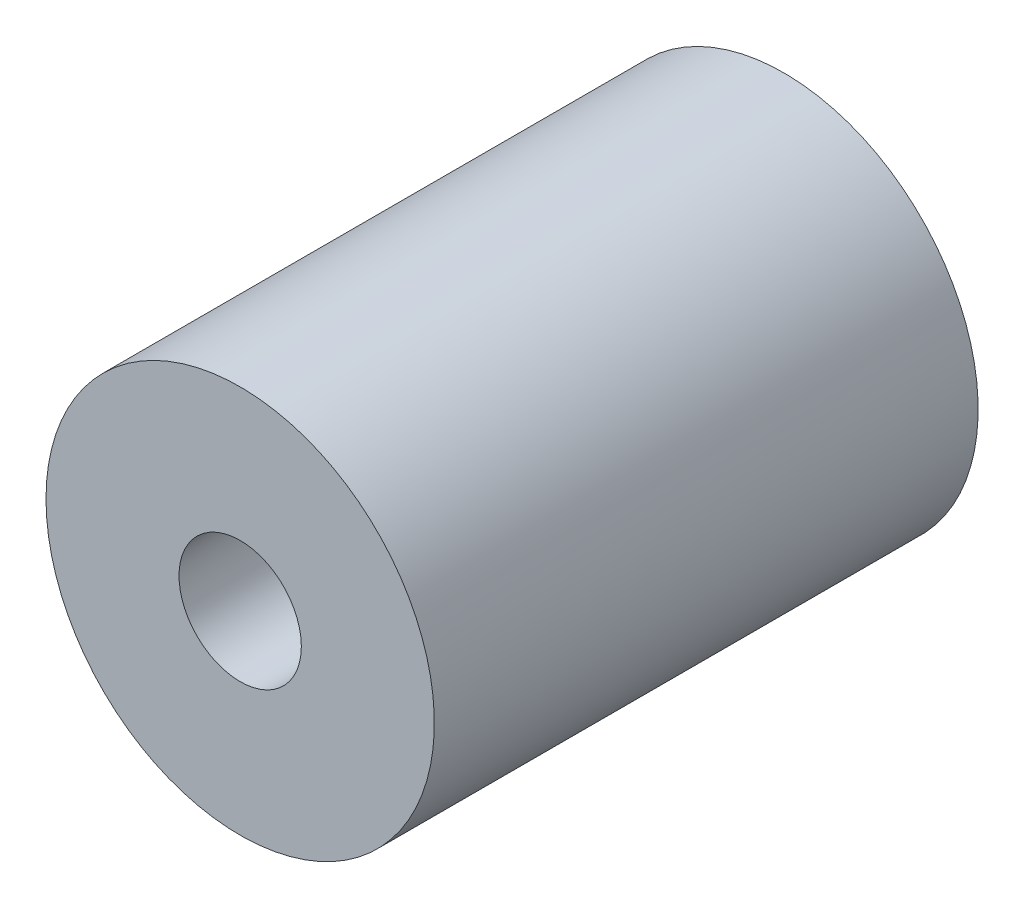
ISO-10303-21;
HEADER;
FILE_DESCRIPTION(('STEP AP214'),'2;1');
FILE_NAME('part.step','',(''),(''),'','','');
FILE_SCHEMA(('AUTOMOTIVE_DESIGN { 1 0 10303 214 1 1 1 1 }'));
ENDSEC;
DATA;
#1=APPLICATION_CONTEXT('core data for automotive mechanical design processes');
#2=APPLICATION_PROTOCOL_DEFINITION('international standard','automotive_design',2000,#1);
#3=PRODUCT_CONTEXT('',#1,'mechanical');
#4=PRODUCT('Part','Part','',(#3));
#5=PRODUCT_RELATED_PRODUCT_CATEGORY('part','',(#4));
#6=PRODUCT_DEFINITION_FORMATION('','',#4);
#7=PRODUCT_DEFINITION_CONTEXT('part definition',#1,'design');
#8=PRODUCT_DEFINITION('design','',#6,#7);
#9=PRODUCT_DEFINITION_SHAPE('','',#8);
#10=(LENGTH_UNIT() NAMED_UNIT(*) SI_UNIT(.MILLI.,.METRE.));
#11=(NAMED_UNIT(*) PLANE_ANGLE_UNIT() SI_UNIT($,.RADIAN.));
#12=(NAMED_UNIT(*) SI_UNIT($,.STERADIAN.) SOLID_ANGLE_UNIT());
#13=UNCERTAINTY_MEASURE_WITH_UNIT(LENGTH_MEASURE(1.E-05),#10,'distance_accuracy_value','');
#14=(GEOMETRIC_REPRESENTATION_CONTEXT(3) GLOBAL_UNCERTAINTY_ASSIGNED_CONTEXT((#13)) GLOBAL_UNIT_ASSIGNED_CONTEXT((#10,
#11,#12)) REPRESENTATION_CONTEXT('',''));
#15=CARTESIAN_POINT('',(0.,0.,0.));
#16=DIRECTION('',(0.,0.,1.));
#17=DIRECTION('',(1.,0.,0.));
#18=AXIS2_PLACEMENT_3D('',#15,#16,#17);
#19=CARTESIAN_POINT('',(0.,0.,0.));
#20=DIRECTION('',(0.,0.,1.));
#21=DIRECTION('',(1.,0.,0.));
#22=AXIS2_PLACEMENT_3D('',#19,#20,#21);
#23=PLANE('',#22);
#24=CARTESIAN_POINT('',(0.,0.,0.));
#25=DIRECTION('',(0.,0.,1.));
#26=DIRECTION('',(1.,0.,0.));
#27=AXIS2_PLACEMENT_3D('',#24,#25,#26);
#28=CIRCLE('',#27,3.);
#29=CARTESIAN_POINT('',(3.,0.,0.));
#30=VERTEX_POINT('',#29);
#31=EDGE_CURVE('E56',#30,#30,#28,.T.);
#32=ORIENTED_EDGE('',*,*,#31,.T.);
#33=EDGE_LOOP('',(#32));
#34=FACE_BOUND('',#33,.T.);
#35=CARTESIAN_POINT('',(0.,0.,0.));
#36=DIRECTION('',(0.,0.,1.));
#37=DIRECTION('',(1.,0.,0.));
#38=AXIS2_PLACEMENT_3D('',#35,#36,#37);
#39=CIRCLE('',#38,9.525);
#40=CARTESIAN_POINT('',(-9.525,0.,0.));
#41=VERTEX_POINT('',#40);
#42=EDGE_CURVE('E49',#41,#41,#39,.T.);
#43=ORIENTED_EDGE('',*,*,#42,.F.);
#44=EDGE_LOOP('',(#43));
#45=FACE_BOUND('',#44,.T.);
#46=ADVANCED_FACE('F45',(#34,#45),#23,.F.);
#47=CARTESIAN_POINT('',(0.,0.,26.675));
#48=DIRECTION('',(0.,0.,-1.));
#49=DIRECTION('',(-1.,0.,0.));
#50=AXIS2_PLACEMENT_3D('',#47,#48,#49);
#51=CYLINDRICAL_SURFACE('',#50,9.525);
#52=CARTESIAN_POINT('',(0.,0.,26.675));
#53=DIRECTION('',(0.,0.,1.));
#54=DIRECTION('',(1.,0.,0.));
#55=AXIS2_PLACEMENT_3D('',#52,#53,#54);
#56=CIRCLE('',#55,9.525);
#57=CARTESIAN_POINT('',(-9.525,0.,26.675));
#58=VERTEX_POINT('',#57);
#59=EDGE_CURVE('E11',#58,#58,#56,.T.);
#60=CARTESIAN_POINT('',(-9.525,0.,26.675));
#61=CARTESIAN_POINT('',(-9.525,0.,26.3971354166667));
#62=CARTESIAN_POINT('',(-9.525,0.,26.1192708333333));
#63=CARTESIAN_POINT('',(-9.525,0.,25.5635416666667));
#64=CARTESIAN_POINT('',(-9.525,0.,25.2856770833333));
#65=CARTESIAN_POINT('',(-9.525,0.,24.7299479166667));
#66=CARTESIAN_POINT('',(-9.525,0.,24.4520833333333));
#67=CARTESIAN_POINT('',(-9.525,0.,23.8963541666667));
#68=CARTESIAN_POINT('',(-9.525,0.,23.6184895833333));
#69=CARTESIAN_POINT('',(-9.525,0.,23.0627604166667));
#70=CARTESIAN_POINT('',(-9.525,0.,22.7848958333333));
#71=CARTESIAN_POINT('',(-9.525,0.,22.2291666666667));
#72=CARTESIAN_POINT('',(-9.525,0.,21.9513020833333));
#73=CARTESIAN_POINT('',(-9.525,0.,21.3955729166667));
#74=CARTESIAN_POINT('',(-9.525,0.,21.1177083333333));
#75=CARTESIAN_POINT('',(-9.525,0.,20.5619791666667));
#76=CARTESIAN_POINT('',(-9.525,0.,20.2841145833333));
#77=CARTESIAN_POINT('',(-9.525,0.,19.7283854166667));
#78=CARTESIAN_POINT('',(-9.525,0.,19.4505208333333));
#79=CARTESIAN_POINT('',(-9.525,0.,18.8947916666667));
#80=CARTESIAN_POINT('',(-9.525,0.,18.6169270833333));
#81=CARTESIAN_POINT('',(-9.525,0.,18.0611979166667));
#82=CARTESIAN_POINT('',(-9.525,0.,17.7833333333333));
#83=CARTESIAN_POINT('',(-9.525,0.,17.2276041666667));
#84=CARTESIAN_POINT('',(-9.525,0.,16.9497395833333));
#85=CARTESIAN_POINT('',(-9.525,0.,16.3940104166667));
#86=CARTESIAN_POINT('',(-9.525,0.,16.1161458333333));
#87=CARTESIAN_POINT('',(-9.525,0.,15.5604166666667));
#88=CARTESIAN_POINT('',(-9.525,0.,15.2825520833333));
#89=CARTESIAN_POINT('',(-9.525,0.,14.7268229166667));
#90=CARTESIAN_POINT('',(-9.525,0.,14.4489583333333));
#91=CARTESIAN_POINT('',(-9.525,0.,13.8932291666667));
#92=CARTESIAN_POINT('',(-9.525,0.,13.6153645833333));
#93=CARTESIAN_POINT('',(-9.525,0.,13.0596354166667));
#94=CARTESIAN_POINT('',(-9.525,0.,12.7817708333333));
#95=CARTESIAN_POINT('',(-9.525,0.,12.2260416666667));
#96=CARTESIAN_POINT('',(-9.525,0.,11.9481770833333));
#97=CARTESIAN_POINT('',(-9.525,0.,11.3924479166667));
#98=CARTESIAN_POINT('',(-9.525,0.,11.1145833333333));
#99=CARTESIAN_POINT('',(-9.525,0.,10.5588541666667));
#100=CARTESIAN_POINT('',(-9.525,0.,10.2809895833333));
#101=CARTESIAN_POINT('',(-9.525,0.,9.72526041666667));
#102=CARTESIAN_POINT('',(-9.525,0.,9.44739583333333));
#103=CARTESIAN_POINT('',(-9.525,0.,8.89166666666667));
#104=CARTESIAN_POINT('',(-9.525,0.,8.61380208333333));
#105=CARTESIAN_POINT('',(-9.525,0.,8.05807291666667));
#106=CARTESIAN_POINT('',(-9.525,0.,7.78020833333333));
#107=CARTESIAN_POINT('',(-9.525,0.,7.22447916666667));
#108=CARTESIAN_POINT('',(-9.525,0.,6.94661458333333));
#109=CARTESIAN_POINT('',(-9.525,0.,6.39088541666667));
#110=CARTESIAN_POINT('',(-9.525,0.,6.11302083333333));
#111=CARTESIAN_POINT('',(-9.525,0.,5.55729166666667));
#112=CARTESIAN_POINT('',(-9.525,0.,5.27942708333333));
#113=CARTESIAN_POINT('',(-9.525,0.,4.72369791666667));
#114=CARTESIAN_POINT('',(-9.525,0.,4.44583333333333));
#115=CARTESIAN_POINT('',(-9.525,0.,3.89010416666667));
#116=CARTESIAN_POINT('',(-9.525,0.,3.61223958333333));
#117=CARTESIAN_POINT('',(-9.525,0.,3.05651041666667));
#118=CARTESIAN_POINT('',(-9.525,0.,2.77864583333333));
#119=CARTESIAN_POINT('',(-9.525,0.,2.22291666666667));
#120=CARTESIAN_POINT('',(-9.525,0.,1.94505208333333));
#121=CARTESIAN_POINT('',(-9.525,0.,1.38932291666667));
#122=CARTESIAN_POINT('',(-9.525,0.,1.11145833333333));
#123=CARTESIAN_POINT('',(-9.525,0.,0.555729166666667));
#124=CARTESIAN_POINT('',(-9.525,0.,0.277864583333333));
#125=CARTESIAN_POINT('',(-9.525,0.,0.));
#126=B_SPLINE_CURVE_WITH_KNOTS('',3,(#60,#61,#62,#63,#64,#65,#66,#67,#68,#69,#70,#71,#72,#73,
#74,#75,#76,#77,#78,#79,#80,#81,#82,#83,#84,#85,#86,#87,#88,#89,#90,#91,#92,#93,#94,#95,#96,#97,
#98,#99,#100,#101,#102,#103,#104,#105,#106,#107,#108,#109,#110,#111,#112,#113,#114,#115,#116,
#117,#118,#119,#120,#121,#122,#123,#124,#125),.UNSPECIFIED.,.F.,.F.,(4,2,2,2,2,2,2,2,2,2,2,2,2,
2,2,2,2,2,2,2,2,2,2,2,2,2,2,2,2,2,2,2,4),(0.,0.833593749999997,1.6671875,2.50078125,3.334375,
4.16796875,5.0015625,5.83515625,6.66875,7.50234375,8.33593749999999,9.16953125,10.003125,
10.83671875,11.6703125,12.50390625,13.3375,14.17109375,15.0046875,15.83828125,16.671875,
17.50546875,18.3390625,19.17265625,20.00625,20.83984375,21.6734375,22.50703125,23.340625,
24.17421875,25.0078125,25.84140625,26.675),.UNSPECIFIED.);
#127=EDGE_CURVE('BSEAM47',#58,#41,#126,.T.);
#128=ORIENTED_EDGE('',*,*,#59,.F.);
#129=ORIENTED_EDGE('',*,*,#42,.T.);
#130=ORIENTED_EDGE('',*,*,#127,.T.);
#131=ORIENTED_EDGE('',*,*,#127,.F.);
#132=EDGE_LOOP('',(#128,#130,#129,#131));
#133=FACE_BOUND('',#132,.T.);
#134=ADVANCED_FACE('F47',(#133),#51,.T.);
#135=CARTESIAN_POINT('',(0.,0.,26.675));
#136=DIRECTION('',(0.,0.,1.));
#137=DIRECTION('',(1.,0.,0.));
#138=AXIS2_PLACEMENT_3D('',#135,#136,#137);
#139=PLANE('',#138);
#140=CARTESIAN_POINT('',(0.,0.,26.675));
#141=DIRECTION('',(0.,0.,1.));
#142=DIRECTION('',(1.,0.,0.));
#143=AXIS2_PLACEMENT_3D('',#140,#141,#142);
#144=CIRCLE('',#143,3.);
#145=CARTESIAN_POINT('',(3.,0.,26.675));
#146=VERTEX_POINT('',#145);
#147=EDGE_CURVE('E58',#146,#146,#144,.T.);
#148=ORIENTED_EDGE('',*,*,#147,.F.);
#149=EDGE_LOOP('',(#148));
#150=FACE_BOUND('',#149,.T.);
#151=ORIENTED_EDGE('',*,*,#59,.T.);
#152=EDGE_LOOP('',(#151));
#153=FACE_BOUND('',#152,.T.);
#154=ADVANCED_FACE('F69',(#150,#153),#139,.T.);
#155=CARTESIAN_POINT('',(0.,0.,0.));
#156=DIRECTION('',(0.,0.,1.));
#157=DIRECTION('',(1.,0.,0.));
#158=AXIS2_PLACEMENT_3D('',#155,#156,#157);
#159=CYLINDRICAL_SURFACE('',#158,3.);
#160=CARTESIAN_POINT('',(3.,0.,0.));
#161=CARTESIAN_POINT('',(3.,0.,0.277864583333333));
#162=CARTESIAN_POINT('',(3.,0.,0.555729166666667));
#163=CARTESIAN_POINT('',(3.,0.,1.11145833333333));
#164=CARTESIAN_POINT('',(3.,0.,1.38932291666667));
#165=CARTESIAN_POINT('',(3.,0.,1.94505208333333));
#166=CARTESIAN_POINT('',(3.,0.,2.22291666666667));
#167=CARTESIAN_POINT('',(3.,0.,2.77864583333333));
#168=CARTESIAN_POINT('',(3.,0.,3.05651041666667));
#169=CARTESIAN_POINT('',(3.,0.,3.61223958333333));
#170=CARTESIAN_POINT('',(3.,0.,3.89010416666667));
#171=CARTESIAN_POINT('',(3.,0.,4.44583333333333));
#172=CARTESIAN_POINT('',(3.,0.,4.72369791666667));
#173=CARTESIAN_POINT('',(3.,0.,5.27942708333333));
#174=CARTESIAN_POINT('',(3.,0.,5.55729166666667));
#175=CARTESIAN_POINT('',(3.,0.,6.11302083333333));
#176=CARTESIAN_POINT('',(3.,0.,6.39088541666667));
#177=CARTESIAN_POINT('',(3.,0.,6.94661458333333));
#178=CARTESIAN_POINT('',(3.,0.,7.22447916666667));
#179=CARTESIAN_POINT('',(3.,0.,7.78020833333333));
#180=CARTESIAN_POINT('',(3.,0.,8.05807291666667));
#181=CARTESIAN_POINT('',(3.,0.,8.61380208333333));
#182=CARTESIAN_POINT('',(3.,0.,8.89166666666667));
#183=CARTESIAN_POINT('',(3.,0.,9.44739583333333));
#184=CARTESIAN_POINT('',(3.,0.,9.72526041666667));
#185=CARTESIAN_POINT('',(3.,0.,10.2809895833333));
#186=CARTESIAN_POINT('',(3.,0.,10.5588541666667));
#187=CARTESIAN_POINT('',(3.,0.,11.1145833333333));
#188=CARTESIAN_POINT('',(3.,0.,11.3924479166667));
#189=CARTESIAN_POINT('',(3.,0.,11.9481770833333));
#190=CARTESIAN_POINT('',(3.,0.,12.2260416666667));
#191=CARTESIAN_POINT('',(3.,0.,12.7817708333333));
#192=CARTESIAN_POINT('',(3.,0.,13.0596354166667));
#193=CARTESIAN_POINT('',(3.,0.,13.6153645833333));
#194=CARTESIAN_POINT('',(3.,0.,13.8932291666667));
#195=CARTESIAN_POINT('',(3.,0.,14.4489583333333));
#196=CARTESIAN_POINT('',(3.,0.,14.7268229166667));
#197=CARTESIAN_POINT('',(3.,0.,15.2825520833333));
#198=CARTESIAN_POINT('',(3.,0.,15.5604166666667));
#199=CARTESIAN_POINT('',(3.,0.,16.1161458333333));
#200=CARTESIAN_POINT('',(3.,0.,16.3940104166667));
#201=CARTESIAN_POINT('',(3.,0.,16.9497395833333));
#202=CARTESIAN_POINT('',(3.,0.,17.2276041666667));
#203=CARTESIAN_POINT('',(3.,0.,17.7833333333333));
#204=CARTESIAN_POINT('',(3.,0.,18.0611979166667));
#205=CARTESIAN_POINT('',(3.,0.,18.6169270833333));
#206=CARTESIAN_POINT('',(3.,0.,18.8947916666667));
#207=CARTESIAN_POINT('',(3.,0.,19.4505208333333));
#208=CARTESIAN_POINT('',(3.,0.,19.7283854166667));
#209=CARTESIAN_POINT('',(3.,0.,20.2841145833333));
#210=CARTESIAN_POINT('',(3.,0.,20.5619791666667));
#211=CARTESIAN_POINT('',(3.,0.,21.1177083333333));
#212=CARTESIAN_POINT('',(3.,0.,21.3955729166667));
#213=CARTESIAN_POINT('',(3.,0.,21.9513020833333));
#214=CARTESIAN_POINT('',(3.,0.,22.2291666666667));
#215=CARTESIAN_POINT('',(3.,0.,22.7848958333333));
#216=CARTESIAN_POINT('',(3.,0.,23.0627604166667));
#217=CARTESIAN_POINT('',(3.,0.,23.6184895833333));
#218=CARTESIAN_POINT('',(3.,0.,23.8963541666667));
#219=CARTESIAN_POINT('',(3.,0.,24.4520833333333));
#220=CARTESIAN_POINT('',(3.,0.,24.7299479166667));
#221=CARTESIAN_POINT('',(3.,0.,25.2856770833333));
#222=CARTESIAN_POINT('',(3.,0.,25.5635416666667));
#223=CARTESIAN_POINT('',(3.,0.,26.1192708333333));
#224=CARTESIAN_POINT('',(3.,0.,26.3971354166667));
#225=CARTESIAN_POINT('',(3.,0.,26.675));
#226=B_SPLINE_CURVE_WITH_KNOTS('',3,(#160,#161,#162,#163,#164,#165,#166,#167,#168,#169,#170,
#171,#172,#173,#174,#175,#176,#177,#178,#179,#180,#181,#182,#183,#184,#185,#186,#187,#188,#189,
#190,#191,#192,#193,#194,#195,#196,#197,#198,#199,#200,#201,#202,#203,#204,#205,#206,#207,#208,
#209,#210,#211,#212,#213,#214,#215,#216,#217,#218,#219,#220,#221,#222,#223,#224,#225),
.UNSPECIFIED.,.F.,.F.,(4,2,2,2,2,2,2,2,2,2,2,2,2,2,2,2,2,2,2,2,2,2,2,2,2,2,2,2,2,2,2,2,4),(0.,
0.83359375,1.6671875,2.50078125,3.334375,4.16796875,5.0015625,5.83515625,6.66875,7.50234375,
8.3359375,9.16953125,10.003125,10.83671875,11.6703125,12.50390625,13.3375,14.17109375,
15.0046875,15.83828125,16.671875,17.50546875,18.3390625,19.17265625,20.00625,20.83984375,
21.6734375,22.50703125,23.340625,24.17421875,25.0078125,25.84140625,26.675),.UNSPECIFIED.);
#227=EDGE_CURVE('BSEAM66',#30,#146,#226,.T.);
#228=ORIENTED_EDGE('',*,*,#31,.F.);
#229=ORIENTED_EDGE('',*,*,#147,.T.);
#230=ORIENTED_EDGE('',*,*,#227,.T.);
#231=ORIENTED_EDGE('',*,*,#227,.F.);
#232=EDGE_LOOP('',(#228,#230,#229,#231));
#233=FACE_BOUND('',#232,.T.);
#234=ADVANCED_FACE('F66',(#233),#159,.F.);
#235=CLOSED_SHELL('',(#46,#134,#154,#234));
#236=MANIFOLD_SOLID_BREP('B2',#235);
#237=ADVANCED_BREP_SHAPE_REPRESENTATION('',(#18,#236),#14);
#238=SHAPE_DEFINITION_REPRESENTATION(#9,#237);
ENDSEC;
END-ISO-10303-21;
